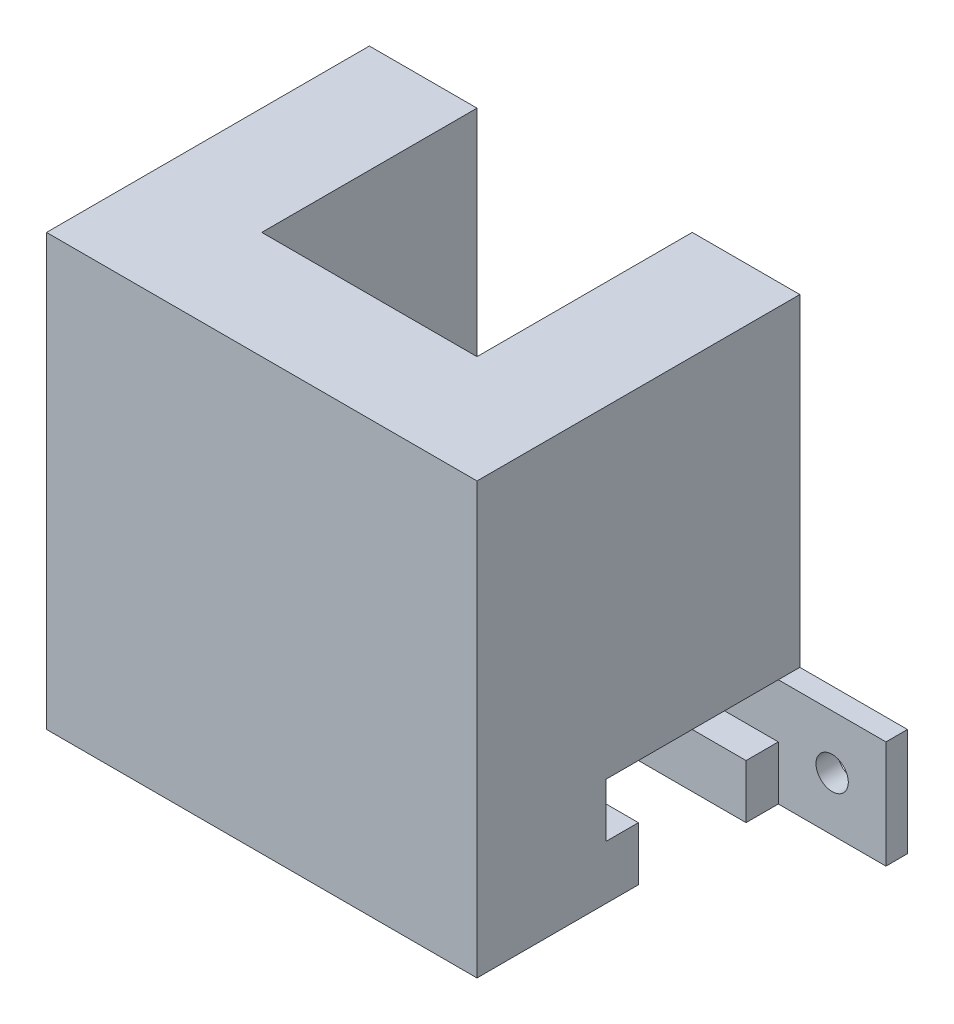
ISO-10303-21;
HEADER;
FILE_DESCRIPTION(('STEP AP214'),'2;1');
FILE_NAME('part.step','',(''),(''),'','','');
FILE_SCHEMA(('AUTOMOTIVE_DESIGN { 1 0 10303 214 1 1 1 1 }'));
ENDSEC;
DATA;
#1=APPLICATION_CONTEXT('core data for automotive mechanical design processes');
#2=APPLICATION_PROTOCOL_DEFINITION('international standard','automotive_design',2000,#1);
#3=PRODUCT_CONTEXT('',#1,'mechanical');
#4=PRODUCT('Part','Part','',(#3));
#5=PRODUCT_RELATED_PRODUCT_CATEGORY('part','',(#4));
#6=PRODUCT_DEFINITION_FORMATION('','',#4);
#7=PRODUCT_DEFINITION_CONTEXT('part definition',#1,'design');
#8=PRODUCT_DEFINITION('design','',#6,#7);
#9=PRODUCT_DEFINITION_SHAPE('','',#8);
#10=(LENGTH_UNIT() NAMED_UNIT(*) SI_UNIT(.MILLI.,.METRE.));
#11=(NAMED_UNIT(*) PLANE_ANGLE_UNIT() SI_UNIT($,.RADIAN.));
#12=(NAMED_UNIT(*) SI_UNIT($,.STERADIAN.) SOLID_ANGLE_UNIT());
#13=UNCERTAINTY_MEASURE_WITH_UNIT(LENGTH_MEASURE(1.E-05),#10,'distance_accuracy_value','');
#14=(GEOMETRIC_REPRESENTATION_CONTEXT(3) GLOBAL_UNCERTAINTY_ASSIGNED_CONTEXT((#13)) GLOBAL_UNIT_ASSIGNED_CONTEXT((#10,
#11,#12)) REPRESENTATION_CONTEXT('',''));
#15=CARTESIAN_POINT('',(0.,0.,0.));
#16=DIRECTION('',(0.,0.,1.));
#17=DIRECTION('',(1.,0.,0.));
#18=AXIS2_PLACEMENT_3D('',#15,#16,#17);
#19=CARTESIAN_POINT('',(-5.07425742574257,-15.,10.));
#20=DIRECTION('',(0.,1.,0.));
#21=DIRECTION('',(0.,0.,1.));
#22=AXIS2_PLACEMENT_3D('',#19,#20,#21);
#23=CYLINDRICAL_SURFACE('',#22,1.8);
#24=CARTESIAN_POINT('',(-5.07425742574258,-5.,10.));
#25=DIRECTION('',(0.,1.,0.));
#26=DIRECTION('',(-1.,0.,0.));
#27=AXIS2_PLACEMENT_3D('',#24,#25,#26);
#28=CIRCLE('',#27,1.8);
#29=CARTESIAN_POINT('',(-6.87425742574258,-5.,10.));
#30=VERTEX_POINT('',#29);
#31=EDGE_CURVE('E429',#30,#30,#28,.T.);
#32=ORIENTED_EDGE('',*,*,#31,.T.);
#33=EDGE_LOOP('',(#32));
#34=FACE_BOUND('',#33,.T.);
#35=CARTESIAN_POINT('',(-5.07425742574257,-10.,10.));
#36=DIRECTION('',(0.,-1.,0.));
#37=DIRECTION('',(0.,0.,-1.));
#38=AXIS2_PLACEMENT_3D('',#35,#36,#37);
#39=CIRCLE('',#38,1.8);
#40=CARTESIAN_POINT('',(-5.07425742574257,-10.,8.2));
#41=VERTEX_POINT('',#40);
#42=EDGE_CURVE('E41',#41,#41,#39,.F.);
#43=ORIENTED_EDGE('',*,*,#42,.F.);
#44=EDGE_LOOP('',(#43));
#45=FACE_BOUND('',#44,.T.);
#46=ADVANCED_FACE('F37',(#34,#45),#23,.F.);
#47=CARTESIAN_POINT('',(-25.0742574257426,-15.,30.));
#48=DIRECTION('',(1.,0.,0.));
#49=DIRECTION('',(0.,0.,-1.));
#50=AXIS2_PLACEMENT_3D('',#47,#48,#49);
#51=PLANE('',#50);
#52=DIRECTION('',(0.,0.,-1.));
#53=VECTOR('',#52,1.);
#54=CARTESIAN_POINT('',(-25.0742574257426,-15.,30.));
#55=LINE('',#54,#53);
#56=CARTESIAN_POINT('',(-25.0742574257426,-15.,5.));
#57=VERTEX_POINT('',#56);
#58=CARTESIAN_POINT('',(-25.0742574257426,-15.,2.));
#59=VERTEX_POINT('',#58);
#60=EDGE_CURVE('E490',#57,#59,#55,.T.);
#61=ORIENTED_EDGE('',*,*,#60,.F.);
#62=DIRECTION('',(0.,-1.,0.));
#63=VECTOR('',#62,1.);
#64=CARTESIAN_POINT('',(-25.0742574257426,-15.,5.));
#65=LINE('',#64,#63);
#66=CARTESIAN_POINT('',(-25.0742574257426,-10.,5.));
#67=VERTEX_POINT('',#66);
#68=EDGE_CURVE('E250',#67,#57,#65,.T.);
#69=ORIENTED_EDGE('',*,*,#68,.F.);
#70=DIRECTION('',(0.,0.,1.));
#71=VECTOR('',#70,1.);
#72=CARTESIAN_POINT('',(-25.0742574257426,-10.,2.));
#73=LINE('',#72,#71);
#74=CARTESIAN_POINT('',(-25.0742574257426,-10.,2.));
#75=VERTEX_POINT('',#74);
#76=EDGE_CURVE('E265',#75,#67,#73,.T.);
#77=ORIENTED_EDGE('',*,*,#76,.F.);
#78=DIRECTION('',(0.,1.,0.));
#79=VECTOR('',#78,1.);
#80=CARTESIAN_POINT('',(-25.0742574257426,-15.,2.));
#81=LINE('',#80,#79);
#82=EDGE_CURVE('E402',#59,#75,#81,.T.);
#83=ORIENTED_EDGE('',*,*,#82,.F.);
#84=EDGE_LOOP('',(#61,#69,#77,#83));
#85=FACE_BOUND('',#84,.T.);
#86=ADVANCED_FACE('F521',(#85),#51,.F.);
#87=CARTESIAN_POINT('',(14.9257425742574,-15.,30.));
#88=DIRECTION('',(-1.,0.,0.));
#89=DIRECTION('',(0.,0.,1.));
#90=AXIS2_PLACEMENT_3D('',#87,#88,#89);
#91=PLANE('',#90);
#92=DIRECTION('',(0.,0.,-1.));
#93=VECTOR('',#92,1.);
#94=CARTESIAN_POINT('',(14.9257425742574,-15.,30.));
#95=LINE('',#94,#93);
#96=CARTESIAN_POINT('',(14.9257425742574,-15.,30.));
#97=VERTEX_POINT('',#96);
#98=CARTESIAN_POINT('',(14.9257425742574,-15.,15.));
#99=VERTEX_POINT('',#98);
#100=EDGE_CURVE('E487',#97,#99,#95,.T.);
#101=ORIENTED_EDGE('',*,*,#100,.T.);
#102=DIRECTION('',(0.,-1.,0.));
#103=VECTOR('',#102,1.);
#104=CARTESIAN_POINT('',(14.9257425742574,-10.,15.));
#105=LINE('',#104,#103);
#106=CARTESIAN_POINT('',(14.9257425742574,-10.,15.));
#107=VERTEX_POINT('',#106);
#108=EDGE_CURVE('E319',#107,#99,#105,.T.);
#109=ORIENTED_EDGE('',*,*,#108,.F.);
#110=DIRECTION('',(0.,0.,-1.));
#111=VECTOR('',#110,1.);
#112=CARTESIAN_POINT('',(14.9257425742574,-10.,18.));
#113=LINE('',#112,#111);
#114=CARTESIAN_POINT('',(14.9257425742574,-10.,18.));
#115=VERTEX_POINT('',#114);
#116=EDGE_CURVE('E350',#115,#107,#113,.T.);
#117=ORIENTED_EDGE('',*,*,#116,.F.);
#118=DIRECTION('',(0.,-1.,0.));
#119=VECTOR('',#118,1.);
#120=CARTESIAN_POINT('',(14.9257425742574,-5.,18.));
#121=LINE('',#120,#119);
#122=CARTESIAN_POINT('',(14.9257425742574,-5.,18.));
#123=VERTEX_POINT('',#122);
#124=EDGE_CURVE('E347',#123,#115,#121,.T.);
#125=ORIENTED_EDGE('',*,*,#124,.F.);
#126=DIRECTION('',(0.,0.,1.));
#127=VECTOR('',#126,1.);
#128=CARTESIAN_POINT('',(14.9257425742574,-5.,18.));
#129=LINE('',#128,#127);
#130=CARTESIAN_POINT('',(14.9257425742574,-5.,2.));
#131=VERTEX_POINT('',#130);
#132=EDGE_CURVE('E344',#131,#123,#129,.T.);
#133=ORIENTED_EDGE('',*,*,#132,.F.);
#134=DIRECTION('',(0.,0.,1.));
#135=VECTOR('',#134,1.);
#136=CARTESIAN_POINT('',(14.9257425742574,-5.,0.));
#137=LINE('',#136,#135);
#138=CARTESIAN_POINT('',(14.9257425742574,-5.,0.));
#139=VERTEX_POINT('',#138);
#140=EDGE_CURVE('E389',#139,#131,#137,.T.);
#141=ORIENTED_EDGE('',*,*,#140,.F.);
#142=DIRECTION('',(0.,1.,0.));
#143=VECTOR('',#142,1.);
#144=CARTESIAN_POINT('',(14.9257425742574,-15.,0.));
#145=LINE('',#144,#143);
#146=CARTESIAN_POINT('',(14.9257425742574,25.,0.));
#147=VERTEX_POINT('',#146);
#148=EDGE_CURVE('E458',#139,#147,#145,.T.);
#149=ORIENTED_EDGE('',*,*,#148,.T.);
#150=DIRECTION('',(0.,0.,-1.));
#151=VECTOR('',#150,1.);
#152=CARTESIAN_POINT('',(14.9257425742574,25.,30.));
#153=LINE('',#152,#151);
#154=CARTESIAN_POINT('',(14.9257425742574,25.,30.));
#155=VERTEX_POINT('',#154);
#156=EDGE_CURVE('E11',#155,#147,#153,.T.);
#157=ORIENTED_EDGE('',*,*,#156,.F.);
#158=DIRECTION('',(0.,1.,0.));
#159=VECTOR('',#158,1.);
#160=CARTESIAN_POINT('',(14.9257425742574,-15.,30.));
#161=LINE('',#160,#159);
#162=EDGE_CURVE('E469',#97,#155,#161,.T.);
#163=ORIENTED_EDGE('',*,*,#162,.F.);
#164=EDGE_LOOP('',(#101,#109,#117,#125,#133,#141,#149,#157,#163));
#165=FACE_BOUND('',#164,.T.);
#166=ADVANCED_FACE('F529',(#165),#91,.F.);
#167=DIRECTION('',(0.,0.,-1.));
#168=VECTOR('',#167,1.);
#169=CARTESIAN_POINT('',(14.9257425742574,-10.,5.));
#170=LINE('',#169,#168);
#171=CARTESIAN_POINT('',(14.9257425742574,-10.,5.));
#172=VERTEX_POINT('',#171);
#173=CARTESIAN_POINT('',(14.9257425742574,-10.,2.));
#174=VERTEX_POINT('',#173);
#175=EDGE_CURVE('E54',#172,#174,#170,.T.);
#176=ORIENTED_EDGE('',*,*,#175,.F.);
#177=DIRECTION('',(0.,1.,0.));
#178=VECTOR('',#177,1.);
#179=CARTESIAN_POINT('',(14.9257425742574,-10.,5.));
#180=LINE('',#179,#178);
#181=CARTESIAN_POINT('',(14.9257425742574,-15.,5.));
#182=VERTEX_POINT('',#181);
#183=EDGE_CURVE('E302',#182,#172,#180,.T.);
#184=ORIENTED_EDGE('',*,*,#183,.F.);
#185=CARTESIAN_POINT('',(14.9257425742574,-15.,2.));
#186=VERTEX_POINT('',#185);
#187=EDGE_CURVE('E62',#182,#186,#95,.T.);
#188=ORIENTED_EDGE('',*,*,#187,.T.);
#189=DIRECTION('',(0.,-1.,0.));
#190=VECTOR('',#189,1.);
#191=CARTESIAN_POINT('',(14.9257425742574,-15.,2.));
#192=LINE('',#191,#190);
#193=EDGE_CURVE('E381',#174,#186,#192,.T.);
#194=ORIENTED_EDGE('',*,*,#193,.F.);
#195=EDGE_LOOP('',(#176,#184,#188,#194));
#196=FACE_BOUND('',#195,.T.);
#197=ADVANCED_FACE('F39',(#196),#91,.F.);
#198=DIRECTION('',(0.,0.,-1.));
#199=VECTOR('',#198,1.);
#200=CARTESIAN_POINT('',(-25.0742574257426,-5.,0.));
#201=LINE('',#200,#199);
#202=CARTESIAN_POINT('',(-25.0742574257426,-5.,2.));
#203=VERTEX_POINT('',#202);
#204=CARTESIAN_POINT('',(-25.0742574257426,-5.,0.));
#205=VERTEX_POINT('',#204);
#206=EDGE_CURVE('E407',#203,#205,#201,.T.);
#207=ORIENTED_EDGE('',*,*,#206,.F.);
#208=DIRECTION('',(0.,0.,-1.));
#209=VECTOR('',#208,1.);
#210=CARTESIAN_POINT('',(-25.0742574257426,-5.,2.));
#211=LINE('',#210,#209);
#212=CARTESIAN_POINT('',(-25.0742574257426,-5.,18.));
#213=VERTEX_POINT('',#212);
#214=EDGE_CURVE('E296',#213,#203,#211,.T.);
#215=ORIENTED_EDGE('',*,*,#214,.F.);
#216=DIRECTION('',(0.,1.,0.));
#217=VECTOR('',#216,1.);
#218=CARTESIAN_POINT('',(-25.0742574257426,-5.,18.));
#219=LINE('',#218,#217);
#220=CARTESIAN_POINT('',(-25.0742574257426,-10.,18.));
#221=VERTEX_POINT('',#220);
#222=EDGE_CURVE('E293',#221,#213,#219,.T.);
#223=ORIENTED_EDGE('',*,*,#222,.F.);
#224=DIRECTION('',(0.,0.,1.));
#225=VECTOR('',#224,1.);
#226=CARTESIAN_POINT('',(-25.0742574257426,-10.,15.));
#227=LINE('',#226,#225);
#228=CARTESIAN_POINT('',(-25.0742574257426,-10.,15.));
#229=VERTEX_POINT('',#228);
#230=EDGE_CURVE('E290',#229,#221,#227,.T.);
#231=ORIENTED_EDGE('',*,*,#230,.F.);
#232=DIRECTION('',(0.,1.,0.));
#233=VECTOR('',#232,1.);
#234=CARTESIAN_POINT('',(-25.0742574257426,-15.,15.));
#235=LINE('',#234,#233);
#236=CARTESIAN_POINT('',(-25.0742574257426,-15.,15.));
#237=VERTEX_POINT('',#236);
#238=EDGE_CURVE('E287',#237,#229,#235,.T.);
#239=ORIENTED_EDGE('',*,*,#238,.F.);
#240=CARTESIAN_POINT('',(-25.0742574257426,-15.,30.));
#241=VERTEX_POINT('',#240);
#242=EDGE_CURVE('E491',#241,#237,#55,.T.);
#243=ORIENTED_EDGE('',*,*,#242,.F.);
#244=DIRECTION('',(0.,-1.,0.));
#245=VECTOR('',#244,1.);
#246=CARTESIAN_POINT('',(-25.0742574257426,-15.,30.));
#247=LINE('',#246,#245);
#248=CARTESIAN_POINT('',(-25.0742574257426,25.,30.));
#249=VERTEX_POINT('',#248);
#250=EDGE_CURVE('E475',#249,#241,#247,.T.);
#251=ORIENTED_EDGE('',*,*,#250,.F.);
#252=DIRECTION('',(0.,0.,-1.));
#253=VECTOR('',#252,1.);
#254=CARTESIAN_POINT('',(-25.0742574257426,25.,30.));
#255=LINE('',#254,#253);
#256=CARTESIAN_POINT('',(-25.0742574257426,25.,0.));
#257=VERTEX_POINT('',#256);
#258=EDGE_CURVE('E46',#249,#257,#255,.T.);
#259=ORIENTED_EDGE('',*,*,#258,.T.);
#260=DIRECTION('',(0.,-1.,0.));
#261=VECTOR('',#260,1.);
#262=CARTESIAN_POINT('',(-25.0742574257426,-15.,0.));
#263=LINE('',#262,#261);
#264=EDGE_CURVE('E484',#257,#205,#263,.T.);
#265=ORIENTED_EDGE('',*,*,#264,.T.);
#266=EDGE_LOOP('',(#207,#215,#223,#231,#239,#243,#251,#259,#265));
#267=FACE_BOUND('',#266,.T.);
#268=ADVANCED_FACE('F532',(#267),#51,.F.);
#269=CARTESIAN_POINT('',(4.92574257425743,5.,20.));
#270=DIRECTION('',(0.,-1.,0.));
#271=DIRECTION('',(0.,0.,-1.));
#272=AXIS2_PLACEMENT_3D('',#269,#270,#271);
#273=PLANE('',#272);
#274=CARTESIAN_POINT('',(-5.07425742574257,5.,10.));
#275=DIRECTION('',(0.,1.,0.));
#276=DIRECTION('',(-1.,0.,0.));
#277=AXIS2_PLACEMENT_3D('',#274,#275,#276);
#278=CIRCLE('',#277,10.);
#279=CARTESIAN_POINT('',(-5.07425742574258,5.,0.));
#280=VERTEX_POINT('',#279);
#281=CARTESIAN_POINT('',(-15.0742574257426,5.,10.));
#282=VERTEX_POINT('',#281);
#283=EDGE_CURVE('E426',#280,#282,#278,.T.);
#284=ORIENTED_EDGE('',*,*,#283,.F.);
#285=DIRECTION('',(-1.,0.,0.));
#286=VECTOR('',#285,1.);
#287=CARTESIAN_POINT('',(4.92574257425743,5.,0.));
#288=LINE('',#287,#286);
#289=CARTESIAN_POINT('',(-15.0742574257426,5.,0.));
#290=VERTEX_POINT('',#289);
#291=EDGE_CURVE('E451',#280,#290,#288,.T.);
#292=ORIENTED_EDGE('',*,*,#291,.T.);
#293=DIRECTION('',(0.,0.,-1.));
#294=VECTOR('',#293,1.);
#295=CARTESIAN_POINT('',(-15.0742574257426,5.,20.));
#296=LINE('',#295,#294);
#297=EDGE_CURVE('E465',#282,#290,#296,.T.);
#298=ORIENTED_EDGE('',*,*,#297,.F.);
#299=EDGE_LOOP('',(#284,#292,#298));
#300=FACE_BOUND('',#299,.T.);
#301=ADVANCED_FACE('F551',(#300),#273,.F.);
#302=CARTESIAN_POINT('',(-5.07425742574257,5.,20.));
#303=VERTEX_POINT('',#302);
#304=EDGE_CURVE('E427',#282,#303,#278,.T.);
#305=ORIENTED_EDGE('',*,*,#304,.F.);
#306=CARTESIAN_POINT('',(-15.0742574257426,5.,20.));
#307=VERTEX_POINT('',#306);
#308=EDGE_CURVE('E462',#307,#282,#296,.T.);
#309=ORIENTED_EDGE('',*,*,#308,.F.);
#310=DIRECTION('',(-1.,0.,0.));
#311=VECTOR('',#310,1.);
#312=CARTESIAN_POINT('',(4.92574257425743,5.,20.));
#313=LINE('',#312,#311);
#314=EDGE_CURVE('E437',#303,#307,#313,.T.);
#315=ORIENTED_EDGE('',*,*,#314,.F.);
#316=EDGE_LOOP('',(#305,#309,#315));
#317=FACE_BOUND('',#316,.T.);
#318=ADVANCED_FACE('F573',(#317),#273,.F.);
#319=CARTESIAN_POINT('',(4.92574257425743,5.,10.));
#320=VERTEX_POINT('',#319);
#321=EDGE_CURVE('E430',#303,#320,#278,.T.);
#322=ORIENTED_EDGE('',*,*,#321,.F.);
#323=CARTESIAN_POINT('',(4.92574257425743,5.,20.));
#324=VERTEX_POINT('',#323);
#325=EDGE_CURVE('E439',#324,#303,#313,.T.);
#326=ORIENTED_EDGE('',*,*,#325,.F.);
#327=DIRECTION('',(0.,0.,-1.));
#328=VECTOR('',#327,1.);
#329=CARTESIAN_POINT('',(4.92574257425743,5.,20.));
#330=LINE('',#329,#328);
#331=EDGE_CURVE('E466',#324,#320,#330,.T.);
#332=ORIENTED_EDGE('',*,*,#331,.T.);
#333=EDGE_LOOP('',(#322,#326,#332));
#334=FACE_BOUND('',#333,.T.);
#335=ADVANCED_FACE('F552',(#334),#273,.F.);
#336=CARTESIAN_POINT('',(-25.0742574257426,25.,30.));
#337=DIRECTION('',(0.,-1.,0.));
#338=DIRECTION('',(0.,0.,-1.));
#339=AXIS2_PLACEMENT_3D('',#336,#337,#338);
#340=PLANE('',#339);
#341=DIRECTION('',(-1.,0.,0.));
#342=VECTOR('',#341,1.);
#343=CARTESIAN_POINT('',(-25.0742574257426,25.,0.));
#344=LINE('',#343,#342);
#345=CARTESIAN_POINT('',(4.92574257425743,25.,0.));
#346=VERTEX_POINT('',#345);
#347=EDGE_CURVE('E481',#147,#346,#344,.T.);
#348=ORIENTED_EDGE('',*,*,#347,.T.);
#349=DIRECTION('',(0.,0.,-1.));
#350=VECTOR('',#349,1.);
#351=CARTESIAN_POINT('',(4.92574257425743,25.,20.));
#352=LINE('',#351,#350);
#353=CARTESIAN_POINT('',(4.92574257425743,25.,20.));
#354=VERTEX_POINT('',#353);
#355=EDGE_CURVE('E456',#354,#346,#352,.T.);
#356=ORIENTED_EDGE('',*,*,#355,.F.);
#357=DIRECTION('',(1.,0.,0.));
#358=VECTOR('',#357,1.);
#359=CARTESIAN_POINT('',(4.92574257425743,25.,20.));
#360=LINE('',#359,#358);
#361=CARTESIAN_POINT('',(-15.0742574257426,25.,20.));
#362=VERTEX_POINT('',#361);
#363=EDGE_CURVE('E445',#362,#354,#360,.T.);
#364=ORIENTED_EDGE('',*,*,#363,.F.);
#365=DIRECTION('',(0.,0.,-1.));
#366=VECTOR('',#365,1.);
#367=CARTESIAN_POINT('',(-15.0742574257426,25.,20.));
#368=LINE('',#367,#366);
#369=CARTESIAN_POINT('',(-15.0742574257426,25.,0.));
#370=VERTEX_POINT('',#369);
#371=EDGE_CURVE('E459',#362,#370,#368,.T.);
#372=ORIENTED_EDGE('',*,*,#371,.T.);
#373=EDGE_CURVE('E480',#370,#257,#344,.T.);
#374=ORIENTED_EDGE('',*,*,#373,.T.);
#375=ORIENTED_EDGE('',*,*,#258,.F.);
#376=DIRECTION('',(-1.,0.,0.));
#377=VECTOR('',#376,1.);
#378=CARTESIAN_POINT('',(-25.0742574257426,25.,30.));
#379=LINE('',#378,#377);
#380=EDGE_CURVE('E472',#155,#249,#379,.T.);
#381=ORIENTED_EDGE('',*,*,#380,.F.);
#382=ORIENTED_EDGE('',*,*,#156,.T.);
#383=EDGE_LOOP('',(#348,#356,#364,#372,#374,#375,#381,#382));
#384=FACE_BOUND('',#383,.T.);
#385=ADVANCED_FACE('F564',(#384),#340,.F.);
#386=CARTESIAN_POINT('',(-25.0742574257426,-15.,30.));
#387=DIRECTION('',(0.,1.,0.));
#388=DIRECTION('',(0.,0.,1.));
#389=AXIS2_PLACEMENT_3D('',#386,#387,#388);
#390=PLANE('',#389);
#391=CARTESIAN_POINT('',(-5.07425742574257,-15.,10.));
#392=DIRECTION('',(0.,-1.,0.));
#393=DIRECTION('',(0.,0.,-1.));
#394=AXIS2_PLACEMENT_3D('',#391,#392,#393);
#395=CIRCLE('',#394,3.);
#396=CARTESIAN_POINT('',(-5.07425742574257,-15.,7.));
#397=VERTEX_POINT('',#396);
#398=EDGE_CURVE('E936',#397,#397,#395,.T.);
#399=ORIENTED_EDGE('',*,*,#398,.F.);
#400=EDGE_LOOP('',(#399));
#401=FACE_BOUND('',#400,.T.);
#402=DIRECTION('',(0.,0.,1.));
#403=VECTOR('',#402,1.);
#404=CARTESIAN_POINT('',(-15.0742574257426,-15.,5.));
#405=LINE('',#404,#403);
#406=CARTESIAN_POINT('',(-15.0742574257426,-15.,5.));
#407=VERTEX_POINT('',#406);
#408=CARTESIAN_POINT('',(-15.0742574257426,-15.,15.));
#409=VERTEX_POINT('',#408);
#410=EDGE_CURVE('E261',#407,#409,#405,.T.);
#411=ORIENTED_EDGE('',*,*,#410,.F.);
#412=DIRECTION('',(-1.,0.,0.));
#413=VECTOR('',#412,1.);
#414=CARTESIAN_POINT('',(-15.0742574257426,-15.,5.));
#415=LINE('',#414,#413);
#416=EDGE_CURVE('E244',#407,#57,#415,.T.);
#417=ORIENTED_EDGE('',*,*,#416,.T.);
#418=ORIENTED_EDGE('',*,*,#60,.T.);
#419=DIRECTION('',(1.,0.,0.));
#420=VECTOR('',#419,1.);
#421=CARTESIAN_POINT('',(-35.0742574257426,-15.,2.));
#422=LINE('',#421,#420);
#423=CARTESIAN_POINT('',(-35.0742574257426,-15.,2.));
#424=VERTEX_POINT('',#423);
#425=EDGE_CURVE('E423',#424,#59,#422,.T.);
#426=ORIENTED_EDGE('',*,*,#425,.F.);
#427=DIRECTION('',(0.,0.,1.));
#428=VECTOR('',#427,1.);
#429=CARTESIAN_POINT('',(-35.0742574257426,-15.,0.));
#430=LINE('',#429,#428);
#431=CARTESIAN_POINT('',(-35.0742574257426,-15.,0.));
#432=VERTEX_POINT('',#431);
#433=EDGE_CURVE('E406',#432,#424,#430,.T.);
#434=ORIENTED_EDGE('',*,*,#433,.F.);
#435=DIRECTION('',(1.,0.,0.));
#436=VECTOR('',#435,1.);
#437=CARTESIAN_POINT('',(-25.0742574257426,-15.,0.));
#438=LINE('',#437,#436);
#439=CARTESIAN_POINT('',(24.9257425742574,-15.,0.));
#440=VERTEX_POINT('',#439);
#441=EDGE_CURVE('E473',#432,#440,#438,.T.);
#442=ORIENTED_EDGE('',*,*,#441,.T.);
#443=DIRECTION('',(0.,0.,-1.));
#444=VECTOR('',#443,1.);
#445=CARTESIAN_POINT('',(24.9257425742574,-15.,0.));
#446=LINE('',#445,#444);
#447=CARTESIAN_POINT('',(24.9257425742574,-15.,2.));
#448=VERTEX_POINT('',#447);
#449=EDGE_CURVE('E385',#448,#440,#446,.T.);
#450=ORIENTED_EDGE('',*,*,#449,.F.);
#451=DIRECTION('',(-1.,0.,0.));
#452=VECTOR('',#451,1.);
#453=CARTESIAN_POINT('',(24.9257425742574,-15.,2.));
#454=LINE('',#453,#452);
#455=EDGE_CURVE('E388',#448,#186,#454,.T.);
#456=ORIENTED_EDGE('',*,*,#455,.T.);
#457=ORIENTED_EDGE('',*,*,#187,.F.);
#458=DIRECTION('',(1.,0.,0.));
#459=VECTOR('',#458,1.);
#460=CARTESIAN_POINT('',(4.92574257425743,-15.,5.));
#461=LINE('',#460,#459);
#462=CARTESIAN_POINT('',(4.92574257425743,-15.,5.));
#463=VERTEX_POINT('',#462);
#464=EDGE_CURVE('E354',#463,#182,#461,.T.);
#465=ORIENTED_EDGE('',*,*,#464,.F.);
#466=DIRECTION('',(0.,0.,-1.));
#467=VECTOR('',#466,1.);
#468=CARTESIAN_POINT('',(4.92574257425743,-15.,15.));
#469=LINE('',#468,#467);
#470=CARTESIAN_POINT('',(4.92574257425743,-15.,15.));
#471=VERTEX_POINT('',#470);
#472=EDGE_CURVE('E337',#471,#463,#469,.T.);
#473=ORIENTED_EDGE('',*,*,#472,.F.);
#474=DIRECTION('',(1.,0.,0.));
#475=VECTOR('',#474,1.);
#476=CARTESIAN_POINT('',(4.92574257425743,-15.,15.));
#477=LINE('',#476,#475);
#478=EDGE_CURVE('E357',#471,#99,#477,.T.);
#479=ORIENTED_EDGE('',*,*,#478,.T.);
#480=ORIENTED_EDGE('',*,*,#100,.F.);
#481=DIRECTION('',(1.,0.,0.));
#482=VECTOR('',#481,1.);
#483=CARTESIAN_POINT('',(-25.0742574257426,-15.,30.));
#484=LINE('',#483,#482);
#485=EDGE_CURVE('E477',#241,#97,#484,.T.);
#486=ORIENTED_EDGE('',*,*,#485,.F.);
#487=ORIENTED_EDGE('',*,*,#242,.T.);
#488=DIRECTION('',(-1.,0.,0.));
#489=VECTOR('',#488,1.);
#490=CARTESIAN_POINT('',(-15.0742574257426,-15.,15.));
#491=LINE('',#490,#489);
#492=EDGE_CURVE('E254',#409,#237,#491,.T.);
#493=ORIENTED_EDGE('',*,*,#492,.F.);
#494=EDGE_LOOP('',(#411,#417,#418,#426,#434,#442,#450,#456,#457,#465,#473,#479,#480,#486,#487,#493));
#495=FACE_BOUND('',#494,.T.);
#496=ADVANCED_FACE('F267',(#401,#495),#390,.F.);
#497=CARTESIAN_POINT('',(0.,0.,30.));
#498=DIRECTION('',(0.,0.,-1.));
#499=DIRECTION('',(-1.,0.,0.));
#500=AXIS2_PLACEMENT_3D('',#497,#498,#499);
#501=PLANE('',#500);
#502=ORIENTED_EDGE('',*,*,#162,.T.);
#503=ORIENTED_EDGE('',*,*,#380,.T.);
#504=ORIENTED_EDGE('',*,*,#250,.T.);
#505=ORIENTED_EDGE('',*,*,#485,.T.);
#506=EDGE_LOOP('',(#502,#503,#504,#505));
#507=FACE_BOUND('',#506,.T.);
#508=ADVANCED_FACE('F557',(#507),#501,.F.);
#509=CARTESIAN_POINT('',(0.,0.,0.));
#510=DIRECTION('',(0.,0.,-1.));
#511=DIRECTION('',(-1.,0.,0.));
#512=AXIS2_PLACEMENT_3D('',#509,#510,#511);
#513=PLANE('',#512);
#514=CARTESIAN_POINT('',(19.9257425742574,-10.,0.));
#515=DIRECTION('',(0.,0.,-1.));
#516=DIRECTION('',(-1.,0.,0.));
#517=AXIS2_PLACEMENT_3D('',#514,#515,#516);
#518=CIRCLE('',#517,1.5);
#519=CARTESIAN_POINT('',(18.4257425742574,-10.,0.));
#520=VERTEX_POINT('',#519);
#521=EDGE_CURVE('E371',#520,#520,#518,.T.);
#522=ORIENTED_EDGE('',*,*,#521,.F.);
#523=EDGE_LOOP('',(#522));
#524=FACE_BOUND('',#523,.T.);
#525=CARTESIAN_POINT('',(-30.0742574257426,-10.,0.));
#526=DIRECTION('',(0.,0.,-1.));
#527=DIRECTION('',(-1.,0.,0.));
#528=AXIS2_PLACEMENT_3D('',#525,#526,#527);
#529=CIRCLE('',#528,1.5);
#530=CARTESIAN_POINT('',(-31.5742574257426,-10.,0.));
#531=VERTEX_POINT('',#530);
#532=EDGE_CURVE('E356',#531,#531,#529,.T.);
#533=ORIENTED_EDGE('',*,*,#532,.F.);
#534=EDGE_LOOP('',(#533));
#535=FACE_BOUND('',#534,.T.);
#536=DIRECTION('',(0.,-1.,0.));
#537=VECTOR('',#536,1.);
#538=CARTESIAN_POINT('',(4.92574257425743,25.,0.));
#539=LINE('',#538,#537);
#540=CARTESIAN_POINT('',(4.92574257425743,5.,0.));
#541=VERTEX_POINT('',#540);
#542=EDGE_CURVE('E433',#346,#541,#539,.T.);
#543=ORIENTED_EDGE('',*,*,#542,.F.);
#544=ORIENTED_EDGE('',*,*,#347,.F.);
#545=ORIENTED_EDGE('',*,*,#148,.F.);
#546=DIRECTION('',(-1.,0.,0.));
#547=VECTOR('',#546,1.);
#548=CARTESIAN_POINT('',(24.9257425742574,-5.,0.));
#549=LINE('',#548,#547);
#550=CARTESIAN_POINT('',(24.9257425742574,-5.,0.));
#551=VERTEX_POINT('',#550);
#552=EDGE_CURVE('E399',#551,#139,#549,.T.);
#553=ORIENTED_EDGE('',*,*,#552,.F.);
#554=DIRECTION('',(0.,1.,0.));
#555=VECTOR('',#554,1.);
#556=CARTESIAN_POINT('',(24.9257425742574,-15.,0.));
#557=LINE('',#556,#555);
#558=EDGE_CURVE('E377',#440,#551,#557,.T.);
#559=ORIENTED_EDGE('',*,*,#558,.F.);
#560=ORIENTED_EDGE('',*,*,#441,.F.);
#561=DIRECTION('',(0.,-1.,0.));
#562=VECTOR('',#561,1.);
#563=CARTESIAN_POINT('',(-35.0742574257426,-15.,0.));
#564=LINE('',#563,#562);
#565=CARTESIAN_POINT('',(-35.0742574257426,-5.,0.));
#566=VERTEX_POINT('',#565);
#567=EDGE_CURVE('E403',#566,#432,#564,.T.);
#568=ORIENTED_EDGE('',*,*,#567,.F.);
#569=DIRECTION('',(1.,0.,0.));
#570=VECTOR('',#569,1.);
#571=CARTESIAN_POINT('',(-35.0742574257426,-5.,0.));
#572=LINE('',#571,#570);
#573=EDGE_CURVE('E413',#566,#205,#572,.T.);
#574=ORIENTED_EDGE('',*,*,#573,.T.);
#575=ORIENTED_EDGE('',*,*,#264,.F.);
#576=ORIENTED_EDGE('',*,*,#373,.F.);
#577=DIRECTION('',(0.,1.,0.));
#578=VECTOR('',#577,1.);
#579=CARTESIAN_POINT('',(-15.0742574257426,25.,0.));
#580=LINE('',#579,#578);
#581=EDGE_CURVE('E438',#290,#370,#580,.T.);
#582=ORIENTED_EDGE('',*,*,#581,.F.);
#583=ORIENTED_EDGE('',*,*,#291,.F.);
#584=EDGE_CURVE('E452',#541,#280,#288,.T.);
#585=ORIENTED_EDGE('',*,*,#584,.F.);
#586=EDGE_LOOP('',(#543,#544,#545,#553,#559,#560,#568,#574,#575,#576,#582,#583,#585));
#587=FACE_BOUND('',#586,.T.);
#588=ADVANCED_FACE('F555',(#524,#535,#587),#513,.T.);
#589=CARTESIAN_POINT('',(4.92574257425743,25.,20.));
#590=DIRECTION('',(1.,0.,0.));
#591=DIRECTION('',(0.,1.,0.));
#592=AXIS2_PLACEMENT_3D('',#589,#590,#591);
#593=PLANE('',#592);
#594=ORIENTED_EDGE('',*,*,#542,.T.);
#595=EDGE_CURVE('E448',#320,#541,#330,.T.);
#596=ORIENTED_EDGE('',*,*,#595,.F.);
#597=ORIENTED_EDGE('',*,*,#331,.F.);
#598=DIRECTION('',(0.,-1.,0.));
#599=VECTOR('',#598,1.);
#600=CARTESIAN_POINT('',(4.92574257425743,25.,20.));
#601=LINE('',#600,#599);
#602=EDGE_CURVE('E434',#354,#324,#601,.T.);
#603=ORIENTED_EDGE('',*,*,#602,.F.);
#604=ORIENTED_EDGE('',*,*,#355,.T.);
#605=EDGE_LOOP('',(#594,#596,#597,#603,#604));
#606=FACE_BOUND('',#605,.T.);
#607=ADVANCED_FACE('F546',(#606),#593,.F.);
#608=CARTESIAN_POINT('',(-15.0742574257426,25.,20.));
#609=DIRECTION('',(-1.,0.,0.));
#610=DIRECTION('',(0.,0.,1.));
#611=AXIS2_PLACEMENT_3D('',#608,#609,#610);
#612=PLANE('',#611);
#613=ORIENTED_EDGE('',*,*,#581,.T.);
#614=ORIENTED_EDGE('',*,*,#371,.F.);
#615=DIRECTION('',(0.,1.,0.));
#616=VECTOR('',#615,1.);
#617=CARTESIAN_POINT('',(-15.0742574257426,25.,20.));
#618=LINE('',#617,#616);
#619=EDGE_CURVE('E442',#307,#362,#618,.T.);
#620=ORIENTED_EDGE('',*,*,#619,.F.);
#621=ORIENTED_EDGE('',*,*,#308,.T.);
#622=ORIENTED_EDGE('',*,*,#297,.T.);
#623=EDGE_LOOP('',(#613,#614,#620,#621,#622));
#624=FACE_BOUND('',#623,.T.);
#625=ADVANCED_FACE('F543',(#624),#612,.F.);
#626=EDGE_CURVE('E671',#320,#280,#278,.T.);
#627=ORIENTED_EDGE('',*,*,#626,.F.);
#628=ORIENTED_EDGE('',*,*,#595,.T.);
#629=ORIENTED_EDGE('',*,*,#584,.T.);
#630=EDGE_LOOP('',(#627,#628,#629));
#631=FACE_BOUND('',#630,.T.);
#632=ADVANCED_FACE('F541',(#631),#273,.F.);
#633=CARTESIAN_POINT('',(0.,0.,20.));
#634=DIRECTION('',(0.,0.,-1.));
#635=DIRECTION('',(-1.,0.,0.));
#636=AXIS2_PLACEMENT_3D('',#633,#634,#635);
#637=PLANE('',#636);
#638=ORIENTED_EDGE('',*,*,#602,.T.);
#639=ORIENTED_EDGE('',*,*,#325,.T.);
#640=ORIENTED_EDGE('',*,*,#314,.T.);
#641=ORIENTED_EDGE('',*,*,#619,.T.);
#642=ORIENTED_EDGE('',*,*,#363,.T.);
#643=EDGE_LOOP('',(#638,#639,#640,#641,#642));
#644=FACE_BOUND('',#643,.T.);
#645=ADVANCED_FACE('F538',(#644),#637,.T.);
#646=CARTESIAN_POINT('',(-5.07425742574258,-5.,10.));
#647=DIRECTION('',(0.,1.,0.));
#648=DIRECTION('',(-1.,0.,0.));
#649=AXIS2_PLACEMENT_3D('',#646,#647,#648);
#650=CONICAL_SURFACE('',#649,1.8,0.686817649758645);
#651=ORIENTED_EDGE('',*,*,#304,.T.);
#652=ORIENTED_EDGE('',*,*,#321,.T.);
#653=ORIENTED_EDGE('',*,*,#626,.T.);
#654=ORIENTED_EDGE('',*,*,#283,.T.);
#655=EDGE_LOOP('',(#651,#652,#653,#654));
#656=FACE_BOUND('',#655,.T.);
#657=ORIENTED_EDGE('',*,*,#31,.F.);
#658=EDGE_LOOP('',(#657));
#659=FACE_BOUND('',#658,.T.);
#660=ADVANCED_FACE('F536',(#656,#659),#650,.F.);
#661=CARTESIAN_POINT('',(-35.0742574257426,-15.,2.));
#662=DIRECTION('',(0.,0.,-1.));
#663=DIRECTION('',(-1.,0.,0.));
#664=AXIS2_PLACEMENT_3D('',#661,#662,#663);
#665=PLANE('',#664);
#666=CARTESIAN_POINT('',(-30.0742574257426,-10.,2.));
#667=DIRECTION('',(0.,0.,-1.));
#668=DIRECTION('',(-1.,0.,0.));
#669=AXIS2_PLACEMENT_3D('',#666,#667,#668);
#670=CIRCLE('',#669,1.5);
#671=CARTESIAN_POINT('',(-31.5742574257426,-10.,2.));
#672=VERTEX_POINT('',#671);
#673=EDGE_CURVE('E392',#672,#672,#670,.T.);
#674=ORIENTED_EDGE('',*,*,#673,.T.);
#675=EDGE_LOOP('',(#674));
#676=FACE_BOUND('',#675,.T.);
#677=ORIENTED_EDGE('',*,*,#82,.T.);
#678=DIRECTION('',(-1.,0.,0.));
#679=VECTOR('',#678,1.);
#680=CARTESIAN_POINT('',(-15.0742574257426,-10.,2.));
#681=LINE('',#680,#679);
#682=CARTESIAN_POINT('',(-15.0742574257426,-10.,2.));
#683=VERTEX_POINT('',#682);
#684=EDGE_CURVE('E303',#683,#75,#681,.T.);
#685=ORIENTED_EDGE('',*,*,#684,.F.);
#686=DIRECTION('',(0.,-1.,0.));
#687=VECTOR('',#686,1.);
#688=CARTESIAN_POINT('',(-15.0742574257426,-5.,2.));
#689=LINE('',#688,#687);
#690=CARTESIAN_POINT('',(-15.0742574257426,-5.,2.));
#691=VERTEX_POINT('',#690);
#692=EDGE_CURVE('E283',#691,#683,#689,.T.);
#693=ORIENTED_EDGE('',*,*,#692,.F.);
#694=DIRECTION('',(-1.,0.,0.));
#695=VECTOR('',#694,1.);
#696=CARTESIAN_POINT('',(-15.0742574257426,-5.,2.));
#697=LINE('',#696,#695);
#698=EDGE_CURVE('E305',#691,#203,#697,.T.);
#699=ORIENTED_EDGE('',*,*,#698,.T.);
#700=DIRECTION('',(1.,0.,0.));
#701=VECTOR('',#700,1.);
#702=CARTESIAN_POINT('',(-35.0742574257426,-5.,2.));
#703=LINE('',#702,#701);
#704=CARTESIAN_POINT('',(-35.0742574257426,-5.,2.));
#705=VERTEX_POINT('',#704);
#706=EDGE_CURVE('E420',#705,#203,#703,.T.);
#707=ORIENTED_EDGE('',*,*,#706,.F.);
#708=DIRECTION('',(0.,1.,0.));
#709=VECTOR('',#708,1.);
#710=CARTESIAN_POINT('',(-35.0742574257426,-15.,2.));
#711=LINE('',#710,#709);
#712=EDGE_CURVE('E409',#424,#705,#711,.T.);
#713=ORIENTED_EDGE('',*,*,#712,.F.);
#714=ORIENTED_EDGE('',*,*,#425,.T.);
#715=EDGE_LOOP('',(#677,#685,#693,#699,#707,#713,#714));
#716=FACE_BOUND('',#715,.T.);
#717=ADVANCED_FACE('F499',(#676,#716),#665,.F.);
#718=CARTESIAN_POINT('',(-35.0742574257426,-5.,0.));
#719=DIRECTION('',(0.,-1.,0.));
#720=DIRECTION('',(0.,0.,-1.));
#721=AXIS2_PLACEMENT_3D('',#718,#719,#720);
#722=PLANE('',#721);
#723=ORIENTED_EDGE('',*,*,#206,.T.);
#724=ORIENTED_EDGE('',*,*,#573,.F.);
#725=DIRECTION('',(0.,0.,-1.));
#726=VECTOR('',#725,1.);
#727=CARTESIAN_POINT('',(-35.0742574257426,-5.,0.));
#728=LINE('',#727,#726);
#729=EDGE_CURVE('E411',#705,#566,#728,.T.);
#730=ORIENTED_EDGE('',*,*,#729,.F.);
#731=ORIENTED_EDGE('',*,*,#706,.T.);
#732=EDGE_LOOP('',(#723,#724,#730,#731));
#733=FACE_BOUND('',#732,.T.);
#734=ADVANCED_FACE('F598',(#733),#722,.F.);
#735=CARTESIAN_POINT('',(-35.0742574257426,0.,0.));
#736=DIRECTION('',(1.,0.,0.));
#737=DIRECTION('',(0.,0.,-1.));
#738=AXIS2_PLACEMENT_3D('',#735,#736,#737);
#739=PLANE('',#738);
#740=ORIENTED_EDGE('',*,*,#567,.T.);
#741=ORIENTED_EDGE('',*,*,#433,.T.);
#742=ORIENTED_EDGE('',*,*,#712,.T.);
#743=ORIENTED_EDGE('',*,*,#729,.T.);
#744=EDGE_LOOP('',(#740,#741,#742,#743));
#745=FACE_BOUND('',#744,.T.);
#746=ADVANCED_FACE('F639',(#745),#739,.F.);
#747=CARTESIAN_POINT('',(24.9257425742574,-5.,0.));
#748=DIRECTION('',(0.,-1.,0.));
#749=DIRECTION('',(0.,0.,-1.));
#750=AXIS2_PLACEMENT_3D('',#747,#748,#749);
#751=PLANE('',#750);
#752=ORIENTED_EDGE('',*,*,#140,.T.);
#753=DIRECTION('',(-1.,0.,0.));
#754=VECTOR('',#753,1.);
#755=CARTESIAN_POINT('',(24.9257425742574,-5.,2.));
#756=LINE('',#755,#754);
#757=CARTESIAN_POINT('',(24.9257425742574,-5.,2.));
#758=VERTEX_POINT('',#757);
#759=EDGE_CURVE('E396',#758,#131,#756,.T.);
#760=ORIENTED_EDGE('',*,*,#759,.F.);
#761=DIRECTION('',(0.,0.,1.));
#762=VECTOR('',#761,1.);
#763=CARTESIAN_POINT('',(24.9257425742574,-5.,0.));
#764=LINE('',#763,#762);
#765=EDGE_CURVE('E380',#551,#758,#764,.T.);
#766=ORIENTED_EDGE('',*,*,#765,.F.);
#767=ORIENTED_EDGE('',*,*,#552,.T.);
#768=EDGE_LOOP('',(#752,#760,#766,#767));
#769=FACE_BOUND('',#768,.T.);
#770=ADVANCED_FACE('F626',(#769),#751,.F.);
#771=CARTESIAN_POINT('',(24.9257425742574,-15.,2.));
#772=DIRECTION('',(0.,0.,-1.));
#773=DIRECTION('',(-1.,0.,0.));
#774=AXIS2_PLACEMENT_3D('',#771,#772,#773);
#775=PLANE('',#774);
#776=CARTESIAN_POINT('',(19.9257425742574,-10.,2.));
#777=DIRECTION('',(0.,0.,-1.));
#778=DIRECTION('',(-1.,0.,0.));
#779=AXIS2_PLACEMENT_3D('',#776,#777,#778);
#780=CIRCLE('',#779,1.5);
#781=CARTESIAN_POINT('',(18.4257425742574,-10.,2.));
#782=VERTEX_POINT('',#781);
#783=EDGE_CURVE('E374',#782,#782,#780,.T.);
#784=ORIENTED_EDGE('',*,*,#783,.T.);
#785=EDGE_LOOP('',(#784));
#786=FACE_BOUND('',#785,.T.);
#787=ORIENTED_EDGE('',*,*,#759,.T.);
#788=DIRECTION('',(1.,0.,0.));
#789=VECTOR('',#788,1.);
#790=CARTESIAN_POINT('',(4.92574257425743,-5.,2.));
#791=LINE('',#790,#789);
#792=CARTESIAN_POINT('',(4.92574257425743,-5.,2.));
#793=VERTEX_POINT('',#792);
#794=EDGE_CURVE('E366',#793,#131,#791,.T.);
#795=ORIENTED_EDGE('',*,*,#794,.F.);
#796=DIRECTION('',(0.,1.,0.));
#797=VECTOR('',#796,1.);
#798=CARTESIAN_POINT('',(4.92574257425743,-5.,2.));
#799=LINE('',#798,#797);
#800=CARTESIAN_POINT('',(4.92574257425743,-10.,2.));
#801=VERTEX_POINT('',#800);
#802=EDGE_CURVE('E322',#801,#793,#799,.T.);
#803=ORIENTED_EDGE('',*,*,#802,.F.);
#804=DIRECTION('',(1.,0.,0.));
#805=VECTOR('',#804,1.);
#806=CARTESIAN_POINT('',(4.92574257425743,-10.,2.));
#807=LINE('',#806,#805);
#808=EDGE_CURVE('E368',#801,#174,#807,.T.);
#809=ORIENTED_EDGE('',*,*,#808,.T.);
#810=ORIENTED_EDGE('',*,*,#193,.T.);
#811=ORIENTED_EDGE('',*,*,#455,.F.);
#812=DIRECTION('',(0.,-1.,0.));
#813=VECTOR('',#812,1.);
#814=CARTESIAN_POINT('',(24.9257425742574,-15.,2.));
#815=LINE('',#814,#813);
#816=EDGE_CURVE('E383',#758,#448,#815,.T.);
#817=ORIENTED_EDGE('',*,*,#816,.F.);
#818=EDGE_LOOP('',(#787,#795,#803,#809,#810,#811,#817));
#819=FACE_BOUND('',#818,.T.);
#820=ADVANCED_FACE('F629',(#786,#819),#775,.F.);
#821=CARTESIAN_POINT('',(24.9257425742574,0.,0.));
#822=DIRECTION('',(1.,0.,0.));
#823=DIRECTION('',(0.,0.,-1.));
#824=AXIS2_PLACEMENT_3D('',#821,#822,#823);
#825=PLANE('',#824);
#826=ORIENTED_EDGE('',*,*,#558,.T.);
#827=ORIENTED_EDGE('',*,*,#765,.T.);
#828=ORIENTED_EDGE('',*,*,#816,.T.);
#829=ORIENTED_EDGE('',*,*,#449,.T.);
#830=EDGE_LOOP('',(#826,#827,#828,#829));
#831=FACE_BOUND('',#830,.T.);
#832=ADVANCED_FACE('F516',(#831),#825,.T.);
#833=CARTESIAN_POINT('',(19.9257425742574,-10.,10.));
#834=DIRECTION('',(0.,0.,-1.));
#835=DIRECTION('',(-1.,0.,0.));
#836=AXIS2_PLACEMENT_3D('',#833,#834,#835);
#837=CYLINDRICAL_SURFACE('',#836,1.5);
#838=ORIENTED_EDGE('',*,*,#521,.T.);
#839=EDGE_LOOP('',(#838));
#840=FACE_BOUND('',#839,.T.);
#841=ORIENTED_EDGE('',*,*,#783,.F.);
#842=EDGE_LOOP('',(#841));
#843=FACE_BOUND('',#842,.T.);
#844=ADVANCED_FACE('F505',(#840,#843),#837,.F.);
#845=CARTESIAN_POINT('',(-30.0742574257426,-10.,10.));
#846=DIRECTION('',(0.,0.,-1.));
#847=DIRECTION('',(-1.,0.,0.));
#848=AXIS2_PLACEMENT_3D('',#845,#846,#847);
#849=CYLINDRICAL_SURFACE('',#848,1.5);
#850=ORIENTED_EDGE('',*,*,#532,.T.);
#851=EDGE_LOOP('',(#850));
#852=FACE_BOUND('',#851,.T.);
#853=ORIENTED_EDGE('',*,*,#673,.F.);
#854=EDGE_LOOP('',(#853));
#855=FACE_BOUND('',#854,.T.);
#856=ADVANCED_FACE('F502',(#852,#855),#849,.F.);
#857=CARTESIAN_POINT('',(4.92574257425743,-10.,5.));
#858=DIRECTION('',(0.,0.,-1.));
#859=DIRECTION('',(-1.,0.,0.));
#860=AXIS2_PLACEMENT_3D('',#857,#858,#859);
#861=PLANE('',#860);
#862=ORIENTED_EDGE('',*,*,#183,.T.);
#863=DIRECTION('',(1.,0.,0.));
#864=VECTOR('',#863,1.);
#865=CARTESIAN_POINT('',(4.92574257425743,-10.,5.));
#866=LINE('',#865,#864);
#867=CARTESIAN_POINT('',(4.92574257425743,-10.,5.));
#868=VERTEX_POINT('',#867);
#869=EDGE_CURVE('E340',#868,#172,#866,.T.);
#870=ORIENTED_EDGE('',*,*,#869,.F.);
#871=DIRECTION('',(0.,1.,0.));
#872=VECTOR('',#871,1.);
#873=CARTESIAN_POINT('',(4.92574257425743,-10.,5.));
#874=LINE('',#873,#872);
#875=EDGE_CURVE('E315',#463,#868,#874,.T.);
#876=ORIENTED_EDGE('',*,*,#875,.F.);
#877=ORIENTED_EDGE('',*,*,#464,.T.);
#878=EDGE_LOOP('',(#862,#870,#876,#877));
#879=FACE_BOUND('',#878,.T.);
#880=ADVANCED_FACE('F504',(#879),#861,.F.);
#881=CARTESIAN_POINT('',(4.92574257425743,-10.,15.));
#882=DIRECTION('',(0.,0.,1.));
#883=DIRECTION('',(0.,-1.,0.));
#884=AXIS2_PLACEMENT_3D('',#881,#882,#883);
#885=PLANE('',#884);
#886=ORIENTED_EDGE('',*,*,#108,.T.);
#887=ORIENTED_EDGE('',*,*,#478,.F.);
#888=DIRECTION('',(0.,-1.,0.));
#889=VECTOR('',#888,1.);
#890=CARTESIAN_POINT('',(4.92574257425743,-10.,15.));
#891=LINE('',#890,#889);
#892=CARTESIAN_POINT('',(4.92574257425743,-10.,15.));
#893=VERTEX_POINT('',#892);
#894=EDGE_CURVE('E334',#893,#471,#891,.T.);
#895=ORIENTED_EDGE('',*,*,#894,.F.);
#896=DIRECTION('',(1.,0.,0.));
#897=VECTOR('',#896,1.);
#898=CARTESIAN_POINT('',(4.92574257425743,-10.,15.));
#899=LINE('',#898,#897);
#900=EDGE_CURVE('E360',#893,#107,#899,.T.);
#901=ORIENTED_EDGE('',*,*,#900,.T.);
#902=EDGE_LOOP('',(#886,#887,#895,#901));
#903=FACE_BOUND('',#902,.T.);
#904=ADVANCED_FACE('F513',(#903),#885,.F.);
#905=CARTESIAN_POINT('',(4.92574257425743,-10.,18.));
#906=DIRECTION('',(0.,-1.,0.));
#907=DIRECTION('',(0.,0.,-1.));
#908=AXIS2_PLACEMENT_3D('',#905,#906,#907);
#909=PLANE('',#908);
#910=ORIENTED_EDGE('',*,*,#116,.T.);
#911=ORIENTED_EDGE('',*,*,#900,.F.);
#912=DIRECTION('',(0.,0.,-1.));
#913=VECTOR('',#912,1.);
#914=CARTESIAN_POINT('',(4.92574257425743,-10.,18.));
#915=LINE('',#914,#913);
#916=CARTESIAN_POINT('',(4.92574257425743,-10.,18.));
#917=VERTEX_POINT('',#916);
#918=EDGE_CURVE('E331',#917,#893,#915,.T.);
#919=ORIENTED_EDGE('',*,*,#918,.F.);
#920=DIRECTION('',(1.,0.,0.));
#921=VECTOR('',#920,1.);
#922=CARTESIAN_POINT('',(4.92574257425743,-10.,18.));
#923=LINE('',#922,#921);
#924=EDGE_CURVE('E362',#917,#115,#923,.T.);
#925=ORIENTED_EDGE('',*,*,#924,.T.);
#926=EDGE_LOOP('',(#910,#911,#919,#925));
#927=FACE_BOUND('',#926,.T.);
#928=ADVANCED_FACE('F783',(#927),#909,.F.);
#929=CARTESIAN_POINT('',(4.92574257425743,-5.,18.));
#930=DIRECTION('',(0.,0.,1.));
#931=DIRECTION('',(1.,0.,0.));
#932=AXIS2_PLACEMENT_3D('',#929,#930,#931);
#933=PLANE('',#932);
#934=ORIENTED_EDGE('',*,*,#124,.T.);
#935=ORIENTED_EDGE('',*,*,#924,.F.);
#936=DIRECTION('',(0.,-1.,0.));
#937=VECTOR('',#936,1.);
#938=CARTESIAN_POINT('',(4.92574257425743,-5.,18.));
#939=LINE('',#938,#937);
#940=CARTESIAN_POINT('',(4.92574257425743,-5.,18.));
#941=VERTEX_POINT('',#940);
#942=EDGE_CURVE('E328',#941,#917,#939,.T.);
#943=ORIENTED_EDGE('',*,*,#942,.F.);
#944=DIRECTION('',(1.,0.,0.));
#945=VECTOR('',#944,1.);
#946=CARTESIAN_POINT('',(4.92574257425743,-5.,18.));
#947=LINE('',#946,#945);
#948=EDGE_CURVE('E364',#941,#123,#947,.T.);
#949=ORIENTED_EDGE('',*,*,#948,.T.);
#950=EDGE_LOOP('',(#934,#935,#943,#949));
#951=FACE_BOUND('',#950,.T.);
#952=ADVANCED_FACE('F793',(#951),#933,.F.);
#953=CARTESIAN_POINT('',(4.92574257425743,-5.,18.));
#954=DIRECTION('',(0.,1.,0.));
#955=DIRECTION('',(0.,0.,1.));
#956=AXIS2_PLACEMENT_3D('',#953,#954,#955);
#957=PLANE('',#956);
#958=ORIENTED_EDGE('',*,*,#132,.T.);
#959=ORIENTED_EDGE('',*,*,#948,.F.);
#960=DIRECTION('',(0.,0.,1.));
#961=VECTOR('',#960,1.);
#962=CARTESIAN_POINT('',(4.92574257425743,-5.,18.));
#963=LINE('',#962,#961);
#964=EDGE_CURVE('E325',#793,#941,#963,.T.);
#965=ORIENTED_EDGE('',*,*,#964,.F.);
#966=ORIENTED_EDGE('',*,*,#794,.T.);
#967=EDGE_LOOP('',(#958,#959,#965,#966));
#968=FACE_BOUND('',#967,.T.);
#969=ADVANCED_FACE('F803',(#968),#957,.F.);
#970=CARTESIAN_POINT('',(4.92574257425743,-10.,5.));
#971=DIRECTION('',(0.,-1.,0.));
#972=DIRECTION('',(0.,0.,-1.));
#973=AXIS2_PLACEMENT_3D('',#970,#971,#972);
#974=PLANE('',#973);
#975=ORIENTED_EDGE('',*,*,#175,.T.);
#976=ORIENTED_EDGE('',*,*,#808,.F.);
#977=DIRECTION('',(0.,0.,-1.));
#978=VECTOR('',#977,1.);
#979=CARTESIAN_POINT('',(4.92574257425743,-10.,5.));
#980=LINE('',#979,#978);
#981=EDGE_CURVE('E318',#868,#801,#980,.T.);
#982=ORIENTED_EDGE('',*,*,#981,.F.);
#983=ORIENTED_EDGE('',*,*,#869,.T.);
#984=EDGE_LOOP('',(#975,#976,#982,#983));
#985=FACE_BOUND('',#984,.T.);
#986=ADVANCED_FACE('F813',(#985),#974,.F.);
#987=CARTESIAN_POINT('',(4.92574257425743,0.,0.));
#988=DIRECTION('',(1.,0.,0.));
#989=DIRECTION('',(0.,0.,-1.));
#990=AXIS2_PLACEMENT_3D('',#987,#988,#989);
#991=PLANE('',#990);
#992=ORIENTED_EDGE('',*,*,#875,.T.);
#993=ORIENTED_EDGE('',*,*,#981,.T.);
#994=ORIENTED_EDGE('',*,*,#802,.T.);
#995=ORIENTED_EDGE('',*,*,#964,.T.);
#996=ORIENTED_EDGE('',*,*,#942,.T.);
#997=ORIENTED_EDGE('',*,*,#918,.T.);
#998=ORIENTED_EDGE('',*,*,#894,.T.);
#999=ORIENTED_EDGE('',*,*,#472,.T.);
#1000=EDGE_LOOP('',(#992,#993,#994,#995,#996,#997,#998,#999));
#1001=FACE_BOUND('',#1000,.T.);
#1002=ADVANCED_FACE('F823',(#1001),#991,.T.);
#1003=CARTESIAN_POINT('',(-15.0742574257426,-15.,5.));
#1004=DIRECTION('',(0.,0.,-1.));
#1005=DIRECTION('',(0.,1.,0.));
#1006=AXIS2_PLACEMENT_3D('',#1003,#1004,#1005);
#1007=PLANE('',#1006);
#1008=ORIENTED_EDGE('',*,*,#68,.T.);
#1009=ORIENTED_EDGE('',*,*,#416,.F.);
#1010=DIRECTION('',(0.,-1.,0.));
#1011=VECTOR('',#1010,1.);
#1012=CARTESIAN_POINT('',(-15.0742574257426,-15.,5.));
#1013=LINE('',#1012,#1011);
#1014=CARTESIAN_POINT('',(-15.0742574257426,-10.,5.));
#1015=VERTEX_POINT('',#1014);
#1016=EDGE_CURVE('E247',#1015,#407,#1013,.T.);
#1017=ORIENTED_EDGE('',*,*,#1016,.F.);
#1018=DIRECTION('',(-1.,0.,0.));
#1019=VECTOR('',#1018,1.);
#1020=CARTESIAN_POINT('',(-15.0742574257426,-10.,5.));
#1021=LINE('',#1020,#1019);
#1022=EDGE_CURVE('E300',#1015,#67,#1021,.T.);
#1023=ORIENTED_EDGE('',*,*,#1022,.T.);
#1024=EDGE_LOOP('',(#1008,#1009,#1017,#1023));
#1025=FACE_BOUND('',#1024,.T.);
#1026=ADVANCED_FACE('F246',(#1025),#1007,.F.);
#1027=CARTESIAN_POINT('',(-15.0742574257426,-10.,2.));
#1028=DIRECTION('',(0.,-1.,0.));
#1029=DIRECTION('',(0.,0.,-1.));
#1030=AXIS2_PLACEMENT_3D('',#1027,#1028,#1029);
#1031=PLANE('',#1030);
#1032=ORIENTED_EDGE('',*,*,#76,.T.);
#1033=ORIENTED_EDGE('',*,*,#1022,.F.);
#1034=DIRECTION('',(0.,0.,1.));
#1035=VECTOR('',#1034,1.);
#1036=CARTESIAN_POINT('',(-15.0742574257426,-10.,2.));
#1037=LINE('',#1036,#1035);
#1038=EDGE_CURVE('E255',#683,#1015,#1037,.T.);
#1039=ORIENTED_EDGE('',*,*,#1038,.F.);
#1040=ORIENTED_EDGE('',*,*,#684,.T.);
#1041=EDGE_LOOP('',(#1032,#1033,#1039,#1040));
#1042=FACE_BOUND('',#1041,.T.);
#1043=ADVANCED_FACE('F855',(#1042),#1031,.F.);
#1044=CARTESIAN_POINT('',(-15.0742574257426,-5.,2.));
#1045=DIRECTION('',(0.,1.,0.));
#1046=DIRECTION('',(0.,0.,1.));
#1047=AXIS2_PLACEMENT_3D('',#1044,#1045,#1046);
#1048=PLANE('',#1047);
#1049=ORIENTED_EDGE('',*,*,#214,.T.);
#1050=ORIENTED_EDGE('',*,*,#698,.F.);
#1051=DIRECTION('',(0.,0.,-1.));
#1052=VECTOR('',#1051,1.);
#1053=CARTESIAN_POINT('',(-15.0742574257426,-5.,2.));
#1054=LINE('',#1053,#1052);
#1055=CARTESIAN_POINT('',(-15.0742574257426,-5.,18.));
#1056=VERTEX_POINT('',#1055);
#1057=EDGE_CURVE('E280',#1056,#691,#1054,.T.);
#1058=ORIENTED_EDGE('',*,*,#1057,.F.);
#1059=DIRECTION('',(-1.,0.,0.));
#1060=VECTOR('',#1059,1.);
#1061=CARTESIAN_POINT('',(-15.0742574257426,-5.,18.));
#1062=LINE('',#1061,#1060);
#1063=EDGE_CURVE('E308',#1056,#213,#1062,.T.);
#1064=ORIENTED_EDGE('',*,*,#1063,.T.);
#1065=EDGE_LOOP('',(#1049,#1050,#1058,#1064));
#1066=FACE_BOUND('',#1065,.T.);
#1067=ADVANCED_FACE('F605',(#1066),#1048,.F.);
#1068=CARTESIAN_POINT('',(-15.0742574257426,-5.,18.));
#1069=DIRECTION('',(0.,0.,1.));
#1070=DIRECTION('',(1.,0.,0.));
#1071=AXIS2_PLACEMENT_3D('',#1068,#1069,#1070);
#1072=PLANE('',#1071);
#1073=ORIENTED_EDGE('',*,*,#222,.T.);
#1074=ORIENTED_EDGE('',*,*,#1063,.F.);
#1075=DIRECTION('',(0.,1.,0.));
#1076=VECTOR('',#1075,1.);
#1077=CARTESIAN_POINT('',(-15.0742574257426,-5.,18.));
#1078=LINE('',#1077,#1076);
#1079=CARTESIAN_POINT('',(-15.0742574257426,-10.,18.));
#1080=VERTEX_POINT('',#1079);
#1081=EDGE_CURVE('E277',#1080,#1056,#1078,.T.);
#1082=ORIENTED_EDGE('',*,*,#1081,.F.);
#1083=DIRECTION('',(-1.,0.,0.));
#1084=VECTOR('',#1083,1.);
#1085=CARTESIAN_POINT('',(-15.0742574257426,-10.,18.));
#1086=LINE('',#1085,#1084);
#1087=EDGE_CURVE('E310',#1080,#221,#1086,.T.);
#1088=ORIENTED_EDGE('',*,*,#1087,.T.);
#1089=EDGE_LOOP('',(#1073,#1074,#1082,#1088));
#1090=FACE_BOUND('',#1089,.T.);
#1091=ADVANCED_FACE('F610',(#1090),#1072,.F.);
#1092=CARTESIAN_POINT('',(-15.0742574257426,-10.,15.));
#1093=DIRECTION('',(0.,-1.,0.));
#1094=DIRECTION('',(0.,0.,-1.));
#1095=AXIS2_PLACEMENT_3D('',#1092,#1093,#1094);
#1096=PLANE('',#1095);
#1097=ORIENTED_EDGE('',*,*,#230,.T.);
#1098=ORIENTED_EDGE('',*,*,#1087,.F.);
#1099=DIRECTION('',(0.,0.,1.));
#1100=VECTOR('',#1099,1.);
#1101=CARTESIAN_POINT('',(-15.0742574257426,-10.,15.));
#1102=LINE('',#1101,#1100);
#1103=CARTESIAN_POINT('',(-15.0742574257426,-10.,15.));
#1104=VERTEX_POINT('',#1103);
#1105=EDGE_CURVE('E271',#1104,#1080,#1102,.T.);
#1106=ORIENTED_EDGE('',*,*,#1105,.F.);
#1107=DIRECTION('',(-1.,0.,0.));
#1108=VECTOR('',#1107,1.);
#1109=CARTESIAN_POINT('',(-15.0742574257426,-10.,15.));
#1110=LINE('',#1109,#1108);
#1111=EDGE_CURVE('E312',#1104,#229,#1110,.T.);
#1112=ORIENTED_EDGE('',*,*,#1111,.T.);
#1113=EDGE_LOOP('',(#1097,#1098,#1106,#1112));
#1114=FACE_BOUND('',#1113,.T.);
#1115=ADVANCED_FACE('F614',(#1114),#1096,.F.);
#1116=CARTESIAN_POINT('',(-15.0742574257426,-15.,15.));
#1117=DIRECTION('',(0.,0.,1.));
#1118=DIRECTION('',(0.,-1.,0.));
#1119=AXIS2_PLACEMENT_3D('',#1116,#1117,#1118);
#1120=PLANE('',#1119);
#1121=ORIENTED_EDGE('',*,*,#238,.T.);
#1122=ORIENTED_EDGE('',*,*,#1111,.F.);
#1123=DIRECTION('',(0.,1.,0.));
#1124=VECTOR('',#1123,1.);
#1125=CARTESIAN_POINT('',(-15.0742574257426,-15.,15.));
#1126=LINE('',#1125,#1124);
#1127=EDGE_CURVE('E269',#409,#1104,#1126,.T.);
#1128=ORIENTED_EDGE('',*,*,#1127,.F.);
#1129=ORIENTED_EDGE('',*,*,#492,.T.);
#1130=EDGE_LOOP('',(#1121,#1122,#1128,#1129));
#1131=FACE_BOUND('',#1130,.T.);
#1132=ADVANCED_FACE('F616',(#1131),#1120,.F.);
#1133=CARTESIAN_POINT('',(-15.0742574257426,0.,0.));
#1134=DIRECTION('',(1.,0.,0.));
#1135=DIRECTION('',(0.,0.,-1.));
#1136=AXIS2_PLACEMENT_3D('',#1133,#1134,#1135);
#1137=PLANE('',#1136);
#1138=ORIENTED_EDGE('',*,*,#1016,.T.);
#1139=ORIENTED_EDGE('',*,*,#410,.T.);
#1140=ORIENTED_EDGE('',*,*,#1127,.T.);
#1141=ORIENTED_EDGE('',*,*,#1105,.T.);
#1142=ORIENTED_EDGE('',*,*,#1081,.T.);
#1143=ORIENTED_EDGE('',*,*,#1057,.T.);
#1144=ORIENTED_EDGE('',*,*,#692,.T.);
#1145=ORIENTED_EDGE('',*,*,#1038,.T.);
#1146=EDGE_LOOP('',(#1138,#1139,#1140,#1141,#1142,#1143,#1144,#1145));
#1147=FACE_BOUND('',#1146,.T.);
#1148=ADVANCED_FACE('F259',(#1147),#1137,.F.);
#1149=CARTESIAN_POINT('',(-5.07425742574257,-10.,10.));
#1150=DIRECTION('',(0.,-1.,0.));
#1151=DIRECTION('',(0.,0.,-1.));
#1152=AXIS2_PLACEMENT_3D('',#1149,#1150,#1151);
#1153=PLANE('',#1152);
#1154=CARTESIAN_POINT('',(-5.07425742574257,-10.,10.));
#1155=DIRECTION('',(0.,-1.,0.));
#1156=DIRECTION('',(0.,0.,-1.));
#1157=AXIS2_PLACEMENT_3D('',#1154,#1155,#1156);
#1158=CIRCLE('',#1157,3.);
#1159=CARTESIAN_POINT('',(-5.07425742574257,-10.,7.));
#1160=VERTEX_POINT('',#1159);
#1161=EDGE_CURVE('E933',#1160,#1160,#1158,.T.);
#1162=ORIENTED_EDGE('',*,*,#1161,.T.);
#1163=EDGE_LOOP('',(#1162));
#1164=FACE_BOUND('',#1163,.T.);
#1165=ORIENTED_EDGE('',*,*,#42,.T.);
#1166=EDGE_LOOP('',(#1165));
#1167=FACE_BOUND('',#1166,.T.);
#1168=ADVANCED_FACE('F903',(#1164,#1167),#1153,.T.);
#1169=CARTESIAN_POINT('',(-5.07425742574257,-10.,10.));
#1170=DIRECTION('',(0.,-1.,0.));
#1171=DIRECTION('',(0.,0.,-1.));
#1172=AXIS2_PLACEMENT_3D('',#1169,#1170,#1171);
#1173=CYLINDRICAL_SURFACE('',#1172,3.);
#1174=ORIENTED_EDGE('',*,*,#1161,.F.);
#1175=EDGE_LOOP('',(#1174));
#1176=FACE_BOUND('',#1175,.T.);
#1177=ORIENTED_EDGE('',*,*,#398,.T.);
#1178=EDGE_LOOP('',(#1177));
#1179=FACE_BOUND('',#1178,.T.);
#1180=ADVANCED_FACE('F912',(#1176,#1179),#1173,.F.);
#1181=CLOSED_SHELL('',(#46,#86,#166,#197,#268,#301,#318,#335,#385,#496,#508,#588,#607,#625,#632,
#645,#660,#717,#734,#746,#770,#820,#832,#844,#856,#880,#904,#928,#952,#969,#986,#1002,#1026,
#1043,#1067,#1091,#1115,#1132,#1148,#1168,#1180));
#1182=MANIFOLD_SOLID_BREP('B2',#1181);
#1183=ADVANCED_BREP_SHAPE_REPRESENTATION('',(#18,#1182),#14);
#1184=SHAPE_DEFINITION_REPRESENTATION(#9,#1183);
ENDSEC;
END-ISO-10303-21;
